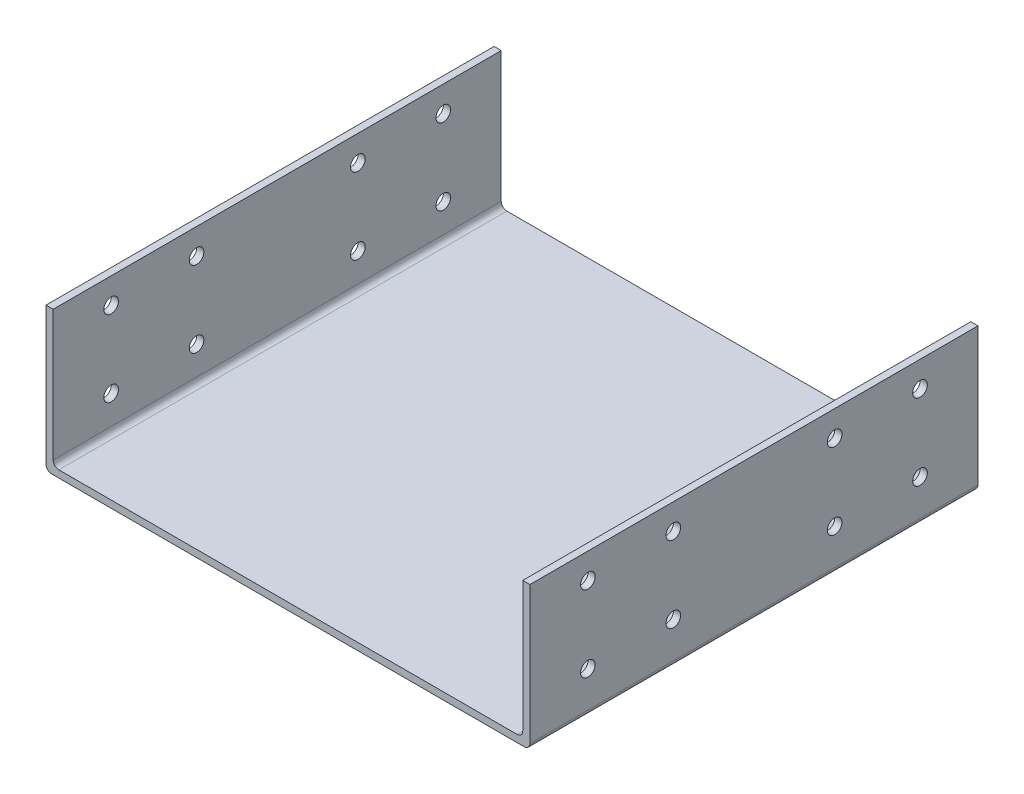
ISO-10303-21;
HEADER;
FILE_DESCRIPTION(('STEP AP214'),'2;1');
FILE_NAME('part.step','',(''),(''),'','','');
FILE_SCHEMA(('AUTOMOTIVE_DESIGN { 1 0 10303 214 1 1 1 1 }'));
ENDSEC;
DATA;
#1=APPLICATION_CONTEXT('core data for automotive mechanical design processes');
#2=APPLICATION_PROTOCOL_DEFINITION('international standard','automotive_design',2000,#1);
#3=PRODUCT_CONTEXT('',#1,'mechanical');
#4=PRODUCT('Part','Part','',(#3));
#5=PRODUCT_RELATED_PRODUCT_CATEGORY('part','',(#4));
#6=PRODUCT_DEFINITION_FORMATION('','',#4);
#7=PRODUCT_DEFINITION_CONTEXT('part definition',#1,'design');
#8=PRODUCT_DEFINITION('design','',#6,#7);
#9=PRODUCT_DEFINITION_SHAPE('','',#8);
#10=(LENGTH_UNIT() NAMED_UNIT(*) SI_UNIT(.MILLI.,.METRE.));
#11=(NAMED_UNIT(*) PLANE_ANGLE_UNIT() SI_UNIT($,.RADIAN.));
#12=(NAMED_UNIT(*) SI_UNIT($,.STERADIAN.) SOLID_ANGLE_UNIT());
#13=UNCERTAINTY_MEASURE_WITH_UNIT(LENGTH_MEASURE(1.E-05),#10,'distance_accuracy_value','');
#14=(GEOMETRIC_REPRESENTATION_CONTEXT(3) GLOBAL_UNCERTAINTY_ASSIGNED_CONTEXT((#13)) GLOBAL_UNIT_ASSIGNED_CONTEXT((#10,
#11,#12)) REPRESENTATION_CONTEXT('',''));
#15=CARTESIAN_POINT('',(0.,0.,0.));
#16=DIRECTION('',(0.,0.,1.));
#17=DIRECTION('',(1.,0.,0.));
#18=AXIS2_PLACEMENT_3D('',#15,#16,#17);
#19=CARTESIAN_POINT('',(0.,50.8,0.));
#20=DIRECTION('',(0.,-1.,0.));
#21=DIRECTION('',(0.,0.,-1.));
#22=AXIS2_PLACEMENT_3D('',#19,#20,#21);
#23=PLANE('',#22);
#24=DIRECTION('',(1.,0.,0.));
#25=VECTOR('',#24,1.);
#26=CARTESIAN_POINT('',(-85.725,50.8,79.375));
#27=LINE('',#26,#25);
#28=CARTESIAN_POINT('',(-85.725,50.8,79.375));
#29=VERTEX_POINT('',#28);
#30=CARTESIAN_POINT('',(-83.185,50.8,79.375));
#31=VERTEX_POINT('',#30);
#32=EDGE_CURVE('E179',#29,#31,#27,.T.);
#33=ORIENTED_EDGE('',*,*,#32,.T.);
#34=DIRECTION('',(0.,0.,1.));
#35=VECTOR('',#34,1.);
#36=CARTESIAN_POINT('',(-83.185,50.8,-79.375));
#37=LINE('',#36,#35);
#38=CARTESIAN_POINT('',(-83.185,50.8,-79.375));
#39=VERTEX_POINT('',#38);
#40=EDGE_CURVE('E159',#39,#31,#37,.T.);
#41=ORIENTED_EDGE('',*,*,#40,.F.);
#42=DIRECTION('',(1.,0.,0.));
#43=VECTOR('',#42,1.);
#44=CARTESIAN_POINT('',(-85.725,50.8,-79.375));
#45=LINE('',#44,#43);
#46=CARTESIAN_POINT('',(-85.725,50.8,-79.375));
#47=VERTEX_POINT('',#46);
#48=EDGE_CURVE('E166',#47,#39,#45,.T.);
#49=ORIENTED_EDGE('',*,*,#48,.F.);
#50=DIRECTION('',(0.,0.,-1.));
#51=VECTOR('',#50,1.);
#52=CARTESIAN_POINT('',(-85.725,50.8,79.375));
#53=LINE('',#52,#51);
#54=EDGE_CURVE('E167',#29,#47,#53,.T.);
#55=ORIENTED_EDGE('',*,*,#54,.F.);
#56=EDGE_LOOP('',(#33,#41,#49,#55));
#57=FACE_BOUND('',#56,.T.);
#58=ADVANCED_FACE('F45',(#57),#23,.F.);
#59=CARTESIAN_POINT('',(-85.725,50.8,79.375));
#60=DIRECTION('',(-1.,0.,0.));
#61=DIRECTION('',(0.,0.,1.));
#62=AXIS2_PLACEMENT_3D('',#59,#60,#61);
#63=PLANE('',#62);
#64=CARTESIAN_POINT('',(-85.725,41.7129,28.58135));
#65=DIRECTION('',(1.,0.,0.));
#66=DIRECTION('',(0.,0.,-1.));
#67=AXIS2_PLACEMENT_3D('',#64,#65,#66);
#68=CIRCLE('',#67,2.5865);
#69=CARTESIAN_POINT('',(-85.725,41.7129,25.99485));
#70=VERTEX_POINT('',#69);
#71=EDGE_CURVE('E613',#70,#70,#68,.T.);
#72=ORIENTED_EDGE('',*,*,#71,.T.);
#73=EDGE_LOOP('',(#72));
#74=FACE_BOUND('',#73,.T.);
#75=CARTESIAN_POINT('',(-85.725,14.7,-58.83275));
#76=DIRECTION('',(1.,0.,0.));
#77=DIRECTION('',(0.,0.,-1.));
#78=AXIS2_PLACEMENT_3D('',#75,#76,#77);
#79=CIRCLE('',#78,2.5908);
#80=CARTESIAN_POINT('',(-85.725,14.7,-61.42355));
#81=VERTEX_POINT('',#80);
#82=EDGE_CURVE('E622',#81,#81,#79,.T.);
#83=ORIENTED_EDGE('',*,*,#82,.T.);
#84=EDGE_LOOP('',(#83));
#85=FACE_BOUND('',#84,.T.);
#86=CARTESIAN_POINT('',(-85.725,41.7129,-58.83275));
#87=DIRECTION('',(1.,0.,0.));
#88=DIRECTION('',(0.,0.,-1.));
#89=AXIS2_PLACEMENT_3D('',#86,#87,#88);
#90=CIRCLE('',#89,2.5908);
#91=CARTESIAN_POINT('',(-85.725,41.7129,-61.42355));
#92=VERTEX_POINT('',#91);
#93=EDGE_CURVE('E597',#92,#92,#90,.T.);
#94=ORIENTED_EDGE('',*,*,#93,.T.);
#95=EDGE_LOOP('',(#94));
#96=FACE_BOUND('',#95,.T.);
#97=CARTESIAN_POINT('',(-85.725,14.7,58.83275));
#98=DIRECTION('',(1.,0.,0.));
#99=DIRECTION('',(0.,0.,-1.));
#100=AXIS2_PLACEMENT_3D('',#97,#98,#99);
#101=CIRCLE('',#100,2.59079999999999);
#102=CARTESIAN_POINT('',(-85.725,14.7,56.24195));
#103=VERTEX_POINT('',#102);
#104=EDGE_CURVE('E606',#103,#103,#101,.T.);
#105=ORIENTED_EDGE('',*,*,#104,.T.);
#106=EDGE_LOOP('',(#105));
#107=FACE_BOUND('',#106,.T.);
#108=CARTESIAN_POINT('',(-85.725,14.7,-28.58135));
#109=DIRECTION('',(1.,0.,0.));
#110=DIRECTION('',(0.,0.,1.));
#111=AXIS2_PLACEMENT_3D('',#108,#109,#110);
#112=CIRCLE('',#111,2.5865);
#113=CARTESIAN_POINT('',(-85.725,14.7,-25.99485));
#114=VERTEX_POINT('',#113);
#115=EDGE_CURVE('E645',#114,#114,#112,.T.);
#116=ORIENTED_EDGE('',*,*,#115,.T.);
#117=EDGE_LOOP('',(#116));
#118=FACE_BOUND('',#117,.T.);
#119=CARTESIAN_POINT('',(-85.725,41.7129,-28.58135));
#120=DIRECTION('',(1.,0.,0.));
#121=DIRECTION('',(0.,0.,-1.));
#122=AXIS2_PLACEMENT_3D('',#119,#120,#121);
#123=CIRCLE('',#122,2.59079999999999);
#124=CARTESIAN_POINT('',(-85.725,41.7129,-31.17215));
#125=VERTEX_POINT('',#124);
#126=EDGE_CURVE('E629',#125,#125,#123,.T.);
#127=ORIENTED_EDGE('',*,*,#126,.T.);
#128=EDGE_LOOP('',(#127));
#129=FACE_BOUND('',#128,.T.);
#130=CARTESIAN_POINT('',(-85.725,14.7,28.58135));
#131=DIRECTION('',(1.,0.,0.));
#132=DIRECTION('',(0.,0.,-1.));
#133=AXIS2_PLACEMENT_3D('',#130,#131,#132);
#134=CIRCLE('',#133,2.5865);
#135=CARTESIAN_POINT('',(-85.725,14.7,25.99485));
#136=VERTEX_POINT('',#135);
#137=EDGE_CURVE('E638',#136,#136,#134,.T.);
#138=ORIENTED_EDGE('',*,*,#137,.T.);
#139=EDGE_LOOP('',(#138));
#140=FACE_BOUND('',#139,.T.);
#141=CARTESIAN_POINT('',(-85.725,41.7129,58.83275));
#142=DIRECTION('',(1.,0.,0.));
#143=DIRECTION('',(0.,0.,-1.));
#144=AXIS2_PLACEMENT_3D('',#141,#142,#143);
#145=CIRCLE('',#144,2.59079999999999);
#146=CARTESIAN_POINT('',(-85.725,41.7129,56.24195));
#147=VERTEX_POINT('',#146);
#148=EDGE_CURVE('E254',#147,#147,#145,.T.);
#149=ORIENTED_EDGE('',*,*,#148,.T.);
#150=EDGE_LOOP('',(#149));
#151=FACE_BOUND('',#150,.T.);
#152=DIRECTION('',(0.,-1.,0.));
#153=VECTOR('',#152,1.);
#154=CARTESIAN_POINT('',(-85.725,50.8,-79.375));
#155=LINE('',#154,#153);
#156=CARTESIAN_POINT('',(-85.725,2.,-79.375));
#157=VERTEX_POINT('',#156);
#158=EDGE_CURVE('E183',#47,#157,#155,.T.);
#159=ORIENTED_EDGE('',*,*,#158,.T.);
#160=DIRECTION('',(0.,0.,-1.));
#161=VECTOR('',#160,1.);
#162=CARTESIAN_POINT('',(-85.725,2.,79.375));
#163=LINE('',#162,#161);
#164=CARTESIAN_POINT('',(-85.725,2.,79.375));
#165=VERTEX_POINT('',#164);
#166=EDGE_CURVE('E216',#157,#165,#163,.F.);
#167=ORIENTED_EDGE('',*,*,#166,.T.);
#168=DIRECTION('',(0.,-1.,0.));
#169=VECTOR('',#168,1.);
#170=CARTESIAN_POINT('',(-85.725,50.8,79.375));
#171=LINE('',#170,#169);
#172=EDGE_CURVE('E190',#29,#165,#171,.T.);
#173=ORIENTED_EDGE('',*,*,#172,.F.);
#174=ORIENTED_EDGE('',*,*,#54,.T.);
#175=EDGE_LOOP('',(#159,#167,#173,#174));
#176=FACE_BOUND('',#175,.T.);
#177=ADVANCED_FACE('F329',(#74,#85,#96,#107,#118,#129,#140,#151,#176),#63,.T.);
#178=CARTESIAN_POINT('',(-85.725,50.8,79.375));
#179=DIRECTION('',(0.,0.,-1.));
#180=DIRECTION('',(-1.,0.,0.));
#181=AXIS2_PLACEMENT_3D('',#178,#179,#180);
#182=PLANE('',#181);
#183=ORIENTED_EDGE('',*,*,#172,.T.);
#184=CARTESIAN_POINT('',(-83.725,2.,79.375));
#185=DIRECTION('',(0.,0.,-1.));
#186=DIRECTION('',(-1.,0.,0.));
#187=AXIS2_PLACEMENT_3D('',#184,#185,#186);
#188=CIRCLE('',#187,2.);
#189=CARTESIAN_POINT('',(-83.725,0.,79.375));
#190=VERTEX_POINT('',#189);
#191=EDGE_CURVE('E221',#165,#190,#188,.F.);
#192=ORIENTED_EDGE('',*,*,#191,.T.);
#193=DIRECTION('',(1.,0.,0.));
#194=VECTOR('',#193,1.);
#195=CARTESIAN_POINT('',(-85.725,0.,79.375));
#196=LINE('',#195,#194);
#197=CARTESIAN_POINT('',(83.725,0.,79.375));
#198=VERTEX_POINT('',#197);
#199=EDGE_CURVE('E173',#190,#198,#196,.T.);
#200=ORIENTED_EDGE('',*,*,#199,.T.);
#201=CARTESIAN_POINT('',(83.725,2.,79.375));
#202=DIRECTION('',(0.,0.,-1.));
#203=DIRECTION('',(-1.,0.,0.));
#204=AXIS2_PLACEMENT_3D('',#201,#202,#203);
#205=CIRCLE('',#204,2.);
#206=CARTESIAN_POINT('',(85.725,2.,79.375));
#207=VERTEX_POINT('',#206);
#208=EDGE_CURVE('E70',#198,#207,#205,.F.);
#209=ORIENTED_EDGE('',*,*,#208,.T.);
#210=DIRECTION('',(0.,-1.,0.));
#211=VECTOR('',#210,1.);
#212=CARTESIAN_POINT('',(85.725,50.8,79.375));
#213=LINE('',#212,#211);
#214=CARTESIAN_POINT('',(85.725,50.8,79.375));
#215=VERTEX_POINT('',#214);
#216=EDGE_CURVE('E195',#215,#207,#213,.T.);
#217=ORIENTED_EDGE('',*,*,#216,.F.);
#218=CARTESIAN_POINT('',(83.185,50.8,79.375));
#219=VERTEX_POINT('',#218);
#220=EDGE_CURVE('E178',#219,#215,#27,.T.);
#221=ORIENTED_EDGE('',*,*,#220,.F.);
#222=DIRECTION('',(0.,1.,0.));
#223=VECTOR('',#222,1.);
#224=CARTESIAN_POINT('',(83.185,50.8,79.375));
#225=LINE('',#224,#223);
#226=CARTESIAN_POINT('',(83.185,4.54000000000002,79.375));
#227=VERTEX_POINT('',#226);
#228=EDGE_CURVE('E155',#227,#219,#225,.T.);
#229=ORIENTED_EDGE('',*,*,#228,.F.);
#230=CARTESIAN_POINT('',(81.185,4.54,79.375));
#231=DIRECTION('',(0.,0.,-1.));
#232=DIRECTION('',(-1.,0.,0.));
#233=AXIS2_PLACEMENT_3D('',#230,#231,#232);
#234=CIRCLE('',#233,2.);
#235=CARTESIAN_POINT('',(81.185,2.54,79.375));
#236=VERTEX_POINT('',#235);
#237=EDGE_CURVE('E55',#227,#236,#234,.T.);
#238=ORIENTED_EDGE('',*,*,#237,.T.);
#239=DIRECTION('',(1.,0.,0.));
#240=VECTOR('',#239,1.);
#241=CARTESIAN_POINT('',(-83.185,2.54,79.375));
#242=LINE('',#241,#240);
#243=CARTESIAN_POINT('',(-81.185,2.54,79.375));
#244=VERTEX_POINT('',#243);
#245=EDGE_CURVE('E310',#244,#236,#242,.T.);
#246=ORIENTED_EDGE('',*,*,#245,.F.);
#247=CARTESIAN_POINT('',(-81.185,4.54,79.375));
#248=DIRECTION('',(0.,0.,-1.));
#249=DIRECTION('',(-1.,0.,0.));
#250=AXIS2_PLACEMENT_3D('',#247,#248,#249);
#251=CIRCLE('',#250,2.);
#252=CARTESIAN_POINT('',(-83.185,4.54000000000002,79.375));
#253=VERTEX_POINT('',#252);
#254=EDGE_CURVE('E241',#244,#253,#251,.T.);
#255=ORIENTED_EDGE('',*,*,#254,.T.);
#256=DIRECTION('',(0.,-1.,0.));
#257=VECTOR('',#256,1.);
#258=CARTESIAN_POINT('',(-83.185,50.8,79.375));
#259=LINE('',#258,#257);
#260=EDGE_CURVE('E300',#31,#253,#259,.T.);
#261=ORIENTED_EDGE('',*,*,#260,.F.);
#262=ORIENTED_EDGE('',*,*,#32,.F.);
#263=EDGE_LOOP('',(#183,#192,#200,#209,#217,#221,#229,#238,#246,#255,#261,#262));
#264=FACE_BOUND('',#263,.T.);
#265=ADVANCED_FACE('F325',(#264),#182,.F.);
#266=CARTESIAN_POINT('',(85.725,50.8,79.375));
#267=DIRECTION('',(-1.,0.,0.));
#268=DIRECTION('',(0.,0.,1.));
#269=AXIS2_PLACEMENT_3D('',#266,#267,#268);
#270=PLANE('',#269);
#271=CARTESIAN_POINT('',(85.725,41.7129,28.58135));
#272=DIRECTION('',(1.,0.,0.));
#273=DIRECTION('',(0.,0.,-1.));
#274=AXIS2_PLACEMENT_3D('',#271,#272,#273);
#275=CIRCLE('',#274,2.5865);
#276=CARTESIAN_POINT('',(85.725,41.7129,25.99485));
#277=VERTEX_POINT('',#276);
#278=EDGE_CURVE('E617',#277,#277,#275,.T.);
#279=ORIENTED_EDGE('',*,*,#278,.F.);
#280=EDGE_LOOP('',(#279));
#281=FACE_BOUND('',#280,.T.);
#282=CARTESIAN_POINT('',(85.725,14.7,-58.83275));
#283=DIRECTION('',(1.,0.,0.));
#284=DIRECTION('',(0.,0.,-1.));
#285=AXIS2_PLACEMENT_3D('',#282,#283,#284);
#286=CIRCLE('',#285,2.5908);
#287=CARTESIAN_POINT('',(85.725,14.7,-61.42355));
#288=VERTEX_POINT('',#287);
#289=EDGE_CURVE('E602',#288,#288,#286,.T.);
#290=ORIENTED_EDGE('',*,*,#289,.F.);
#291=EDGE_LOOP('',(#290));
#292=FACE_BOUND('',#291,.T.);
#293=CARTESIAN_POINT('',(85.725,41.7129,-58.83275));
#294=DIRECTION('',(1.,0.,0.));
#295=DIRECTION('',(0.,0.,-1.));
#296=AXIS2_PLACEMENT_3D('',#293,#294,#295);
#297=CIRCLE('',#296,2.5908);
#298=CARTESIAN_POINT('',(85.725,41.7129,-61.42355));
#299=VERTEX_POINT('',#298);
#300=EDGE_CURVE('E601',#299,#299,#297,.T.);
#301=ORIENTED_EDGE('',*,*,#300,.F.);
#302=EDGE_LOOP('',(#301));
#303=FACE_BOUND('',#302,.T.);
#304=CARTESIAN_POINT('',(85.725,14.7,58.83275));
#305=DIRECTION('',(1.,0.,0.));
#306=DIRECTION('',(0.,0.,-1.));
#307=AXIS2_PLACEMENT_3D('',#304,#305,#306);
#308=CIRCLE('',#307,2.59079999999999);
#309=CARTESIAN_POINT('',(85.725,14.7,56.24195));
#310=VERTEX_POINT('',#309);
#311=EDGE_CURVE('E593',#310,#310,#308,.T.);
#312=ORIENTED_EDGE('',*,*,#311,.F.);
#313=EDGE_LOOP('',(#312));
#314=FACE_BOUND('',#313,.T.);
#315=CARTESIAN_POINT('',(85.725,14.7,-28.58135));
#316=DIRECTION('',(1.,0.,0.));
#317=DIRECTION('',(0.,0.,1.));
#318=AXIS2_PLACEMENT_3D('',#315,#316,#317);
#319=CIRCLE('',#318,2.5865);
#320=CARTESIAN_POINT('',(85.725,14.7,-25.99485));
#321=VERTEX_POINT('',#320);
#322=EDGE_CURVE('E634',#321,#321,#319,.T.);
#323=ORIENTED_EDGE('',*,*,#322,.F.);
#324=EDGE_LOOP('',(#323));
#325=FACE_BOUND('',#324,.T.);
#326=CARTESIAN_POINT('',(85.725,41.7129,-28.58135));
#327=DIRECTION('',(1.,0.,0.));
#328=DIRECTION('',(0.,0.,-1.));
#329=AXIS2_PLACEMENT_3D('',#326,#327,#328);
#330=CIRCLE('',#329,2.59079999999999);
#331=CARTESIAN_POINT('',(85.725,41.7129,-31.17215));
#332=VERTEX_POINT('',#331);
#333=EDGE_CURVE('E633',#332,#332,#330,.T.);
#334=ORIENTED_EDGE('',*,*,#333,.F.);
#335=EDGE_LOOP('',(#334));
#336=FACE_BOUND('',#335,.T.);
#337=CARTESIAN_POINT('',(85.725,14.7,28.58135));
#338=DIRECTION('',(1.,0.,0.));
#339=DIRECTION('',(0.,0.,-1.));
#340=AXIS2_PLACEMENT_3D('',#337,#338,#339);
#341=CIRCLE('',#340,2.5865);
#342=CARTESIAN_POINT('',(85.725,14.7,25.99485));
#343=VERTEX_POINT('',#342);
#344=EDGE_CURVE('E618',#343,#343,#341,.T.);
#345=ORIENTED_EDGE('',*,*,#344,.F.);
#346=EDGE_LOOP('',(#345));
#347=FACE_BOUND('',#346,.T.);
#348=CARTESIAN_POINT('',(85.725,41.7129,58.83275));
#349=DIRECTION('',(1.,0.,0.));
#350=DIRECTION('',(0.,0.,-1.));
#351=AXIS2_PLACEMENT_3D('',#348,#349,#350);
#352=CIRCLE('',#351,2.59079999999999);
#353=CARTESIAN_POINT('',(85.725,41.7129,56.24195));
#354=VERTEX_POINT('',#353);
#355=EDGE_CURVE('E584',#354,#354,#352,.T.);
#356=ORIENTED_EDGE('',*,*,#355,.F.);
#357=EDGE_LOOP('',(#356));
#358=FACE_BOUND('',#357,.T.);
#359=ORIENTED_EDGE('',*,*,#216,.T.);
#360=DIRECTION('',(0.,0.,-1.));
#361=VECTOR('',#360,1.);
#362=CARTESIAN_POINT('',(85.725,2.,-79.375));
#363=LINE('',#362,#361);
#364=CARTESIAN_POINT('',(85.725,2.,-79.375));
#365=VERTEX_POINT('',#364);
#366=EDGE_CURVE('E224',#207,#365,#363,.T.);
#367=ORIENTED_EDGE('',*,*,#366,.T.);
#368=DIRECTION('',(0.,-1.,0.));
#369=VECTOR('',#368,1.);
#370=CARTESIAN_POINT('',(85.725,50.8,-79.375));
#371=LINE('',#370,#369);
#372=CARTESIAN_POINT('',(85.725,50.8,-79.375));
#373=VERTEX_POINT('',#372);
#374=EDGE_CURVE('E198',#373,#365,#371,.T.);
#375=ORIENTED_EDGE('',*,*,#374,.F.);
#376=DIRECTION('',(0.,0.,-1.));
#377=VECTOR('',#376,1.);
#378=CARTESIAN_POINT('',(85.725,50.8,79.375));
#379=LINE('',#378,#377);
#380=EDGE_CURVE('E163',#215,#373,#379,.T.);
#381=ORIENTED_EDGE('',*,*,#380,.F.);
#382=EDGE_LOOP('',(#359,#367,#375,#381));
#383=FACE_BOUND('',#382,.T.);
#384=ADVANCED_FACE('F343',(#281,#292,#303,#314,#325,#336,#347,#358,#383),#270,.F.);
#385=CARTESIAN_POINT('',(-85.725,50.8,-79.375));
#386=DIRECTION('',(0.,0.,-1.));
#387=DIRECTION('',(-1.,0.,0.));
#388=AXIS2_PLACEMENT_3D('',#385,#386,#387);
#389=PLANE('',#388);
#390=DIRECTION('',(1.,0.,0.));
#391=VECTOR('',#390,1.);
#392=CARTESIAN_POINT('',(-85.725,0.,-79.375));
#393=LINE('',#392,#391);
#394=CARTESIAN_POINT('',(-83.725,0.,-79.375));
#395=VERTEX_POINT('',#394);
#396=CARTESIAN_POINT('',(83.725,0.,-79.375));
#397=VERTEX_POINT('',#396);
#398=EDGE_CURVE('E184',#395,#397,#393,.T.);
#399=ORIENTED_EDGE('',*,*,#398,.F.);
#400=CARTESIAN_POINT('',(-83.725,2.,-79.375));
#401=DIRECTION('',(0.,0.,-1.));
#402=DIRECTION('',(-1.,0.,0.));
#403=AXIS2_PLACEMENT_3D('',#400,#401,#402);
#404=CIRCLE('',#403,2.);
#405=EDGE_CURVE('E213',#395,#157,#404,.T.);
#406=ORIENTED_EDGE('',*,*,#405,.T.);
#407=ORIENTED_EDGE('',*,*,#158,.F.);
#408=ORIENTED_EDGE('',*,*,#48,.T.);
#409=DIRECTION('',(0.,-1.,0.));
#410=VECTOR('',#409,1.);
#411=CARTESIAN_POINT('',(-83.185,50.8,-79.375));
#412=LINE('',#411,#410);
#413=CARTESIAN_POINT('',(-83.185,4.54000000000002,-79.375));
#414=VERTEX_POINT('',#413);
#415=EDGE_CURVE('E301',#39,#414,#412,.T.);
#416=ORIENTED_EDGE('',*,*,#415,.T.);
#417=CARTESIAN_POINT('',(-81.185,4.54,-79.375));
#418=DIRECTION('',(0.,0.,-1.));
#419=DIRECTION('',(-1.,0.,0.));
#420=AXIS2_PLACEMENT_3D('',#417,#418,#419);
#421=CIRCLE('',#420,2.);
#422=CARTESIAN_POINT('',(-81.185,2.54,-79.375));
#423=VERTEX_POINT('',#422);
#424=EDGE_CURVE('E244',#414,#423,#421,.F.);
#425=ORIENTED_EDGE('',*,*,#424,.T.);
#426=DIRECTION('',(1.,0.,0.));
#427=VECTOR('',#426,1.);
#428=CARTESIAN_POINT('',(-83.185,2.54,-79.375));
#429=LINE('',#428,#427);
#430=CARTESIAN_POINT('',(81.185,2.54,-79.375));
#431=VERTEX_POINT('',#430);
#432=EDGE_CURVE('E150',#423,#431,#429,.T.);
#433=ORIENTED_EDGE('',*,*,#432,.T.);
#434=CARTESIAN_POINT('',(81.185,4.54,-79.375));
#435=DIRECTION('',(0.,0.,-1.));
#436=DIRECTION('',(-1.,0.,0.));
#437=AXIS2_PLACEMENT_3D('',#434,#435,#436);
#438=CIRCLE('',#437,2.);
#439=CARTESIAN_POINT('',(83.185,4.54000000000002,-79.375));
#440=VERTEX_POINT('',#439);
#441=EDGE_CURVE('E11',#431,#440,#438,.F.);
#442=ORIENTED_EDGE('',*,*,#441,.T.);
#443=DIRECTION('',(0.,1.,0.));
#444=VECTOR('',#443,1.);
#445=CARTESIAN_POINT('',(83.185,50.8,-79.375));
#446=LINE('',#445,#444);
#447=CARTESIAN_POINT('',(83.185,50.8,-79.375));
#448=VERTEX_POINT('',#447);
#449=EDGE_CURVE('E137',#440,#448,#446,.T.);
#450=ORIENTED_EDGE('',*,*,#449,.T.);
#451=EDGE_CURVE('E143',#448,#373,#45,.T.);
#452=ORIENTED_EDGE('',*,*,#451,.T.);
#453=ORIENTED_EDGE('',*,*,#374,.T.);
#454=CARTESIAN_POINT('',(83.725,2.,-79.375));
#455=DIRECTION('',(0.,0.,-1.));
#456=DIRECTION('',(-1.,0.,0.));
#457=AXIS2_PLACEMENT_3D('',#454,#455,#456);
#458=CIRCLE('',#457,2.);
#459=EDGE_CURVE('E210',#365,#397,#458,.T.);
#460=ORIENTED_EDGE('',*,*,#459,.T.);
#461=EDGE_LOOP('',(#399,#406,#407,#408,#416,#425,#433,#442,#450,#452,#453,#460));
#462=FACE_BOUND('',#461,.T.);
#463=ADVANCED_FACE('F140',(#462),#389,.T.);
#464=ORIENTED_EDGE('',*,*,#451,.F.);
#465=DIRECTION('',(0.,0.,1.));
#466=VECTOR('',#465,1.);
#467=CARTESIAN_POINT('',(83.185,50.8,-79.375));
#468=LINE('',#467,#466);
#469=EDGE_CURVE('E149',#448,#219,#468,.T.);
#470=ORIENTED_EDGE('',*,*,#469,.T.);
#471=ORIENTED_EDGE('',*,*,#220,.T.);
#472=ORIENTED_EDGE('',*,*,#380,.T.);
#473=EDGE_LOOP('',(#464,#470,#471,#472));
#474=FACE_BOUND('',#473,.T.);
#475=ADVANCED_FACE('F161',(#474),#23,.F.);
#476=CARTESIAN_POINT('',(0.,0.,0.));
#477=DIRECTION('',(0.,-1.,0.));
#478=DIRECTION('',(0.,0.,-1.));
#479=AXIS2_PLACEMENT_3D('',#476,#477,#478);
#480=PLANE('',#479);
#481=ORIENTED_EDGE('',*,*,#199,.F.);
#482=DIRECTION('',(0.,0.,-1.));
#483=VECTOR('',#482,1.);
#484=CARTESIAN_POINT('',(-83.725,0.,0.));
#485=LINE('',#484,#483);
#486=EDGE_CURVE('E206',#190,#395,#485,.T.);
#487=ORIENTED_EDGE('',*,*,#486,.T.);
#488=ORIENTED_EDGE('',*,*,#398,.T.);
#489=DIRECTION('',(0.,0.,-1.));
#490=VECTOR('',#489,1.);
#491=CARTESIAN_POINT('',(83.725,0.,79.375));
#492=LINE('',#491,#490);
#493=EDGE_CURVE('E194',#397,#198,#492,.F.);
#494=ORIENTED_EDGE('',*,*,#493,.T.);
#495=EDGE_LOOP('',(#481,#487,#488,#494));
#496=FACE_BOUND('',#495,.T.);
#497=ADVANCED_FACE('F337',(#496),#480,.T.);
#498=CARTESIAN_POINT('',(-83.185,50.8,-79.375));
#499=DIRECTION('',(-1.,0.,0.));
#500=DIRECTION('',(0.,0.,1.));
#501=AXIS2_PLACEMENT_3D('',#498,#499,#500);
#502=PLANE('',#501);
#503=CARTESIAN_POINT('',(-83.185,41.7129,28.58135));
#504=DIRECTION('',(-1.,0.,0.));
#505=DIRECTION('',(0.,0.,1.));
#506=AXIS2_PLACEMENT_3D('',#503,#504,#505);
#507=CIRCLE('',#506,2.5865);
#508=CARTESIAN_POINT('',(-83.185,41.7129,31.16785));
#509=VERTEX_POINT('',#508);
#510=EDGE_CURVE('E296',#509,#509,#507,.T.);
#511=ORIENTED_EDGE('',*,*,#510,.T.);
#512=EDGE_LOOP('',(#511));
#513=FACE_BOUND('',#512,.T.);
#514=CARTESIAN_POINT('',(-83.185,14.7,-58.83275));
#515=DIRECTION('',(-1.,0.,0.));
#516=DIRECTION('',(0.,0.,1.));
#517=AXIS2_PLACEMENT_3D('',#514,#515,#516);
#518=CIRCLE('',#517,2.5908);
#519=CARTESIAN_POINT('',(-83.185,14.7,-56.24195));
#520=VERTEX_POINT('',#519);
#521=EDGE_CURVE('E282',#520,#520,#518,.T.);
#522=ORIENTED_EDGE('',*,*,#521,.T.);
#523=EDGE_LOOP('',(#522));
#524=FACE_BOUND('',#523,.T.);
#525=CARTESIAN_POINT('',(-83.185,41.7129,-58.83275));
#526=DIRECTION('',(-1.,0.,0.));
#527=DIRECTION('',(0.,0.,1.));
#528=AXIS2_PLACEMENT_3D('',#525,#526,#527);
#529=CIRCLE('',#528,2.5908);
#530=CARTESIAN_POINT('',(-83.185,41.7129,-56.24195));
#531=VERTEX_POINT('',#530);
#532=EDGE_CURVE('E278',#531,#531,#529,.T.);
#533=ORIENTED_EDGE('',*,*,#532,.T.);
#534=EDGE_LOOP('',(#533));
#535=FACE_BOUND('',#534,.T.);
#536=CARTESIAN_POINT('',(-83.185,14.7,58.83275));
#537=DIRECTION('',(-1.,0.,0.));
#538=DIRECTION('',(0.,0.,1.));
#539=AXIS2_PLACEMENT_3D('',#536,#537,#538);
#540=CIRCLE('',#539,2.59079999999999);
#541=CARTESIAN_POINT('',(-83.185,14.7,61.42355));
#542=VERTEX_POINT('',#541);
#543=EDGE_CURVE('E274',#542,#542,#540,.T.);
#544=ORIENTED_EDGE('',*,*,#543,.T.);
#545=EDGE_LOOP('',(#544));
#546=FACE_BOUND('',#545,.T.);
#547=CARTESIAN_POINT('',(-83.185,14.7,-28.58135));
#548=DIRECTION('',(-1.,0.,0.));
#549=DIRECTION('',(0.,0.,1.));
#550=AXIS2_PLACEMENT_3D('',#547,#548,#549);
#551=CIRCLE('',#550,2.5865);
#552=CARTESIAN_POINT('',(-83.185,14.7,-25.99485));
#553=VERTEX_POINT('',#552);
#554=EDGE_CURVE('E269',#553,#553,#551,.T.);
#555=ORIENTED_EDGE('',*,*,#554,.T.);
#556=EDGE_LOOP('',(#555));
#557=FACE_BOUND('',#556,.T.);
#558=CARTESIAN_POINT('',(-83.185,41.7129,-28.58135));
#559=DIRECTION('',(-1.,0.,0.));
#560=DIRECTION('',(0.,0.,1.));
#561=AXIS2_PLACEMENT_3D('',#558,#559,#560);
#562=CIRCLE('',#561,2.59079999999999);
#563=CARTESIAN_POINT('',(-83.185,41.7129,-25.99055));
#564=VERTEX_POINT('',#563);
#565=EDGE_CURVE('E264',#564,#564,#562,.T.);
#566=ORIENTED_EDGE('',*,*,#565,.T.);
#567=EDGE_LOOP('',(#566));
#568=FACE_BOUND('',#567,.T.);
#569=CARTESIAN_POINT('',(-83.185,14.7,28.58135));
#570=DIRECTION('',(-1.,0.,0.));
#571=DIRECTION('',(0.,0.,1.));
#572=AXIS2_PLACEMENT_3D('',#569,#570,#571);
#573=CIRCLE('',#572,2.5865);
#574=CARTESIAN_POINT('',(-83.185,14.7,31.16785));
#575=VERTEX_POINT('',#574);
#576=EDGE_CURVE('E259',#575,#575,#573,.T.);
#577=ORIENTED_EDGE('',*,*,#576,.T.);
#578=EDGE_LOOP('',(#577));
#579=FACE_BOUND('',#578,.T.);
#580=CARTESIAN_POINT('',(-83.185,41.7129,58.83275));
#581=DIRECTION('',(-1.,0.,0.));
#582=DIRECTION('',(0.,0.,1.));
#583=AXIS2_PLACEMENT_3D('',#580,#581,#582);
#584=CIRCLE('',#583,2.59079999999999);
#585=CARTESIAN_POINT('',(-83.185,41.7129,61.42355));
#586=VERTEX_POINT('',#585);
#587=EDGE_CURVE('E253',#586,#586,#584,.T.);
#588=ORIENTED_EDGE('',*,*,#587,.T.);
#589=EDGE_LOOP('',(#588));
#590=FACE_BOUND('',#589,.T.);
#591=ORIENTED_EDGE('',*,*,#260,.T.);
#592=DIRECTION('',(0.,0.,1.));
#593=VECTOR('',#592,1.);
#594=CARTESIAN_POINT('',(-83.185,4.54,-79.375));
#595=LINE('',#594,#593);
#596=EDGE_CURVE('E235',#253,#414,#595,.F.);
#597=ORIENTED_EDGE('',*,*,#596,.T.);
#598=ORIENTED_EDGE('',*,*,#415,.F.);
#599=ORIENTED_EDGE('',*,*,#40,.T.);
#600=EDGE_LOOP('',(#591,#597,#598,#599));
#601=FACE_BOUND('',#600,.T.);
#602=ADVANCED_FACE('F320',(#513,#524,#535,#546,#557,#568,#579,#590,#601),#502,.F.);
#603=CARTESIAN_POINT('',(83.185,50.8,-79.375));
#604=DIRECTION('',(1.,0.,0.));
#605=DIRECTION('',(0.,0.,-1.));
#606=AXIS2_PLACEMENT_3D('',#603,#604,#605);
#607=PLANE('',#606);
#608=CARTESIAN_POINT('',(83.185,41.7129,28.58135));
#609=DIRECTION('',(1.,0.,0.));
#610=DIRECTION('',(0.,0.,-1.));
#611=AXIS2_PLACEMENT_3D('',#608,#609,#610);
#612=CIRCLE('',#611,2.5865);
#613=CARTESIAN_POINT('',(83.185,41.7129,25.99485));
#614=VERTEX_POINT('',#613);
#615=EDGE_CURVE('E49',#614,#614,#612,.T.);
#616=ORIENTED_EDGE('',*,*,#615,.T.);
#617=EDGE_LOOP('',(#616));
#618=FACE_BOUND('',#617,.T.);
#619=CARTESIAN_POINT('',(83.185,14.7,-58.83275));
#620=DIRECTION('',(1.,0.,0.));
#621=DIRECTION('',(0.,0.,-1.));
#622=AXIS2_PLACEMENT_3D('',#619,#620,#621);
#623=CIRCLE('',#622,2.5908);
#624=CARTESIAN_POINT('',(83.185,14.7,-61.42355));
#625=VERTEX_POINT('',#624);
#626=EDGE_CURVE('E279',#625,#625,#623,.T.);
#627=ORIENTED_EDGE('',*,*,#626,.T.);
#628=EDGE_LOOP('',(#627));
#629=FACE_BOUND('',#628,.T.);
#630=CARTESIAN_POINT('',(83.185,41.7129,-58.83275));
#631=DIRECTION('',(1.,0.,0.));
#632=DIRECTION('',(0.,0.,-1.));
#633=AXIS2_PLACEMENT_3D('',#630,#631,#632);
#634=CIRCLE('',#633,2.5908);
#635=CARTESIAN_POINT('',(83.185,41.7129,-61.42355));
#636=VERTEX_POINT('',#635);
#637=EDGE_CURVE('E275',#636,#636,#634,.T.);
#638=ORIENTED_EDGE('',*,*,#637,.T.);
#639=EDGE_LOOP('',(#638));
#640=FACE_BOUND('',#639,.T.);
#641=CARTESIAN_POINT('',(83.185,14.7,58.83275));
#642=DIRECTION('',(1.,0.,0.));
#643=DIRECTION('',(0.,0.,-1.));
#644=AXIS2_PLACEMENT_3D('',#641,#642,#643);
#645=CIRCLE('',#644,2.59079999999999);
#646=CARTESIAN_POINT('',(83.185,14.7,56.24195));
#647=VERTEX_POINT('',#646);
#648=EDGE_CURVE('E270',#647,#647,#645,.T.);
#649=ORIENTED_EDGE('',*,*,#648,.T.);
#650=EDGE_LOOP('',(#649));
#651=FACE_BOUND('',#650,.T.);
#652=CARTESIAN_POINT('',(83.185,14.7,-28.58135));
#653=DIRECTION('',(1.,0.,0.));
#654=DIRECTION('',(0.,0.,-1.));
#655=AXIS2_PLACEMENT_3D('',#652,#653,#654);
#656=CIRCLE('',#655,2.5865);
#657=CARTESIAN_POINT('',(83.185,14.7,-31.16785));
#658=VERTEX_POINT('',#657);
#659=EDGE_CURVE('E265',#658,#658,#656,.T.);
#660=ORIENTED_EDGE('',*,*,#659,.T.);
#661=EDGE_LOOP('',(#660));
#662=FACE_BOUND('',#661,.T.);
#663=CARTESIAN_POINT('',(83.185,41.7129,-28.58135));
#664=DIRECTION('',(1.,0.,0.));
#665=DIRECTION('',(0.,0.,-1.));
#666=AXIS2_PLACEMENT_3D('',#663,#664,#665);
#667=CIRCLE('',#666,2.59079999999999);
#668=CARTESIAN_POINT('',(83.185,41.7129,-31.17215));
#669=VERTEX_POINT('',#668);
#670=EDGE_CURVE('E260',#669,#669,#667,.T.);
#671=ORIENTED_EDGE('',*,*,#670,.T.);
#672=EDGE_LOOP('',(#671));
#673=FACE_BOUND('',#672,.T.);
#674=CARTESIAN_POINT('',(83.185,14.7,28.58135));
#675=DIRECTION('',(1.,0.,0.));
#676=DIRECTION('',(0.,0.,-1.));
#677=AXIS2_PLACEMENT_3D('',#674,#675,#676);
#678=CIRCLE('',#677,2.5865);
#679=CARTESIAN_POINT('',(83.185,14.7,25.99485));
#680=VERTEX_POINT('',#679);
#681=EDGE_CURVE('E255',#680,#680,#678,.T.);
#682=ORIENTED_EDGE('',*,*,#681,.T.);
#683=EDGE_LOOP('',(#682));
#684=FACE_BOUND('',#683,.T.);
#685=CARTESIAN_POINT('',(83.185,41.7129,58.83275));
#686=DIRECTION('',(1.,0.,0.));
#687=DIRECTION('',(0.,0.,-1.));
#688=AXIS2_PLACEMENT_3D('',#685,#686,#687);
#689=CIRCLE('',#688,2.59079999999999);
#690=CARTESIAN_POINT('',(83.185,41.7129,56.24195));
#691=VERTEX_POINT('',#690);
#692=EDGE_CURVE('E249',#691,#691,#689,.T.);
#693=ORIENTED_EDGE('',*,*,#692,.T.);
#694=EDGE_LOOP('',(#693));
#695=FACE_BOUND('',#694,.T.);
#696=ORIENTED_EDGE('',*,*,#449,.F.);
#697=DIRECTION('',(0.,0.,1.));
#698=VECTOR('',#697,1.);
#699=CARTESIAN_POINT('',(83.185,4.54,79.375));
#700=LINE('',#699,#698);
#701=EDGE_CURVE('E238',#440,#227,#700,.T.);
#702=ORIENTED_EDGE('',*,*,#701,.T.);
#703=ORIENTED_EDGE('',*,*,#228,.T.);
#704=ORIENTED_EDGE('',*,*,#469,.F.);
#705=EDGE_LOOP('',(#696,#702,#703,#704));
#706=FACE_BOUND('',#705,.T.);
#707=ADVANCED_FACE('F153',(#618,#629,#640,#651,#662,#673,#684,#695,#706),#607,.F.);
#708=CARTESIAN_POINT('',(-83.185,2.54,-79.375));
#709=DIRECTION('',(0.,-1.,0.));
#710=DIRECTION('',(0.,0.,-1.));
#711=AXIS2_PLACEMENT_3D('',#708,#709,#710);
#712=PLANE('',#711);
#713=ORIENTED_EDGE('',*,*,#432,.F.);
#714=DIRECTION('',(0.,0.,1.));
#715=VECTOR('',#714,1.);
#716=CARTESIAN_POINT('',(-81.185,2.54,79.375));
#717=LINE('',#716,#715);
#718=EDGE_CURVE('E231',#423,#244,#717,.T.);
#719=ORIENTED_EDGE('',*,*,#718,.T.);
#720=ORIENTED_EDGE('',*,*,#245,.T.);
#721=DIRECTION('',(0.,0.,1.));
#722=VECTOR('',#721,1.);
#723=CARTESIAN_POINT('',(81.185,2.54,-79.375));
#724=LINE('',#723,#722);
#725=EDGE_CURVE('E228',#236,#431,#724,.F.);
#726=ORIENTED_EDGE('',*,*,#725,.T.);
#727=EDGE_LOOP('',(#713,#719,#720,#726));
#728=FACE_BOUND('',#727,.T.);
#729=ADVANCED_FACE('F347',(#728),#712,.F.);
#730=CARTESIAN_POINT('',(-83.725,2.,0.));
#731=DIRECTION('',(0.,0.,-1.));
#732=DIRECTION('',(-1.,0.,0.));
#733=AXIS2_PLACEMENT_3D('',#730,#731,#732);
#734=CYLINDRICAL_SURFACE('',#733,2.);
#735=ORIENTED_EDGE('',*,*,#191,.F.);
#736=ORIENTED_EDGE('',*,*,#166,.F.);
#737=ORIENTED_EDGE('',*,*,#405,.F.);
#738=ORIENTED_EDGE('',*,*,#486,.F.);
#739=EDGE_LOOP('',(#735,#736,#737,#738));
#740=FACE_BOUND('',#739,.T.);
#741=ADVANCED_FACE('F335',(#740),#734,.T.);
#742=CARTESIAN_POINT('',(83.725,2.,79.375));
#743=DIRECTION('',(0.,0.,1.));
#744=DIRECTION('',(1.,0.,0.));
#745=AXIS2_PLACEMENT_3D('',#742,#743,#744);
#746=CYLINDRICAL_SURFACE('',#745,2.);
#747=ORIENTED_EDGE('',*,*,#208,.F.);
#748=ORIENTED_EDGE('',*,*,#493,.F.);
#749=ORIENTED_EDGE('',*,*,#459,.F.);
#750=ORIENTED_EDGE('',*,*,#366,.F.);
#751=EDGE_LOOP('',(#747,#748,#749,#750));
#752=FACE_BOUND('',#751,.T.);
#753=ADVANCED_FACE('F341',(#752),#746,.T.);
#754=CARTESIAN_POINT('',(-81.185,4.54,-79.375));
#755=DIRECTION('',(0.,0.,-1.));
#756=DIRECTION('',(-1.,0.,0.));
#757=AXIS2_PLACEMENT_3D('',#754,#755,#756);
#758=CYLINDRICAL_SURFACE('',#757,2.);
#759=ORIENTED_EDGE('',*,*,#424,.F.);
#760=ORIENTED_EDGE('',*,*,#596,.F.);
#761=ORIENTED_EDGE('',*,*,#254,.F.);
#762=ORIENTED_EDGE('',*,*,#718,.F.);
#763=EDGE_LOOP('',(#759,#760,#761,#762));
#764=FACE_BOUND('',#763,.T.);
#765=ADVANCED_FACE('F351',(#764),#758,.F.);
#766=CARTESIAN_POINT('',(81.185,4.54,-79.375));
#767=DIRECTION('',(0.,0.,-1.));
#768=DIRECTION('',(-1.,0.,0.));
#769=AXIS2_PLACEMENT_3D('',#766,#767,#768);
#770=CYLINDRICAL_SURFACE('',#769,2.);
#771=ORIENTED_EDGE('',*,*,#441,.F.);
#772=ORIENTED_EDGE('',*,*,#725,.F.);
#773=ORIENTED_EDGE('',*,*,#237,.F.);
#774=ORIENTED_EDGE('',*,*,#701,.F.);
#775=EDGE_LOOP('',(#771,#772,#773,#774));
#776=FACE_BOUND('',#775,.T.);
#777=ADVANCED_FACE('F47',(#776),#770,.F.);
#778=CARTESIAN_POINT('',(-85.725,41.7129,58.83275));
#779=DIRECTION('',(1.,0.,0.));
#780=DIRECTION('',(0.,0.,-1.));
#781=AXIS2_PLACEMENT_3D('',#778,#779,#780);
#782=CYLINDRICAL_SURFACE('',#781,2.59079999999999);
#783=ORIENTED_EDGE('',*,*,#355,.T.);
#784=EDGE_LOOP('',(#783));
#785=FACE_BOUND('',#784,.T.);
#786=ORIENTED_EDGE('',*,*,#692,.F.);
#787=EDGE_LOOP('',(#786));
#788=FACE_BOUND('',#787,.T.);
#789=ADVANCED_FACE('F350',(#785,#788),#782,.F.);
#790=CARTESIAN_POINT('',(-85.725,14.7,28.58135));
#791=DIRECTION('',(1.,0.,0.));
#792=DIRECTION('',(0.,0.,-1.));
#793=AXIS2_PLACEMENT_3D('',#790,#791,#792);
#794=CYLINDRICAL_SURFACE('',#793,2.5865);
#795=ORIENTED_EDGE('',*,*,#344,.T.);
#796=EDGE_LOOP('',(#795));
#797=FACE_BOUND('',#796,.T.);
#798=ORIENTED_EDGE('',*,*,#681,.F.);
#799=EDGE_LOOP('',(#798));
#800=FACE_BOUND('',#799,.T.);
#801=ADVANCED_FACE('F357',(#797,#800),#794,.F.);
#802=CARTESIAN_POINT('',(-85.725,41.7129,-28.58135));
#803=DIRECTION('',(1.,0.,0.));
#804=DIRECTION('',(0.,0.,-1.));
#805=AXIS2_PLACEMENT_3D('',#802,#803,#804);
#806=CYLINDRICAL_SURFACE('',#805,2.59079999999999);
#807=ORIENTED_EDGE('',*,*,#333,.T.);
#808=EDGE_LOOP('',(#807));
#809=FACE_BOUND('',#808,.T.);
#810=ORIENTED_EDGE('',*,*,#670,.F.);
#811=EDGE_LOOP('',(#810));
#812=FACE_BOUND('',#811,.T.);
#813=ADVANCED_FACE('F418',(#809,#812),#806,.F.);
#814=CARTESIAN_POINT('',(-85.725,14.7,-28.58135));
#815=DIRECTION('',(1.,0.,0.));
#816=DIRECTION('',(0.,0.,-1.));
#817=AXIS2_PLACEMENT_3D('',#814,#815,#816);
#818=CYLINDRICAL_SURFACE('',#817,2.5865);
#819=ORIENTED_EDGE('',*,*,#322,.T.);
#820=EDGE_LOOP('',(#819));
#821=FACE_BOUND('',#820,.T.);
#822=ORIENTED_EDGE('',*,*,#659,.F.);
#823=EDGE_LOOP('',(#822));
#824=FACE_BOUND('',#823,.T.);
#825=ADVANCED_FACE('F429',(#821,#824),#818,.F.);
#826=CARTESIAN_POINT('',(-85.725,14.7,58.83275));
#827=DIRECTION('',(1.,0.,0.));
#828=DIRECTION('',(0.,0.,-1.));
#829=AXIS2_PLACEMENT_3D('',#826,#827,#828);
#830=CYLINDRICAL_SURFACE('',#829,2.59079999999999);
#831=ORIENTED_EDGE('',*,*,#311,.T.);
#832=EDGE_LOOP('',(#831));
#833=FACE_BOUND('',#832,.T.);
#834=ORIENTED_EDGE('',*,*,#648,.F.);
#835=EDGE_LOOP('',(#834));
#836=FACE_BOUND('',#835,.T.);
#837=ADVANCED_FACE('F440',(#833,#836),#830,.F.);
#838=CARTESIAN_POINT('',(-85.725,41.7129,-58.83275));
#839=DIRECTION('',(1.,0.,0.));
#840=DIRECTION('',(0.,0.,-1.));
#841=AXIS2_PLACEMENT_3D('',#838,#839,#840);
#842=CYLINDRICAL_SURFACE('',#841,2.5908);
#843=ORIENTED_EDGE('',*,*,#300,.T.);
#844=EDGE_LOOP('',(#843));
#845=FACE_BOUND('',#844,.T.);
#846=ORIENTED_EDGE('',*,*,#637,.F.);
#847=EDGE_LOOP('',(#846));
#848=FACE_BOUND('',#847,.T.);
#849=ADVANCED_FACE('F451',(#845,#848),#842,.F.);
#850=CARTESIAN_POINT('',(-85.725,14.7,-58.83275));
#851=DIRECTION('',(1.,0.,0.));
#852=DIRECTION('',(0.,0.,-1.));
#853=AXIS2_PLACEMENT_3D('',#850,#851,#852);
#854=CYLINDRICAL_SURFACE('',#853,2.5908);
#855=ORIENTED_EDGE('',*,*,#289,.T.);
#856=EDGE_LOOP('',(#855));
#857=FACE_BOUND('',#856,.T.);
#858=ORIENTED_EDGE('',*,*,#626,.F.);
#859=EDGE_LOOP('',(#858));
#860=FACE_BOUND('',#859,.T.);
#861=ADVANCED_FACE('F462',(#857,#860),#854,.F.);
#862=CARTESIAN_POINT('',(-85.725,41.7129,28.58135));
#863=DIRECTION('',(1.,0.,0.));
#864=DIRECTION('',(0.,0.,-1.));
#865=AXIS2_PLACEMENT_3D('',#862,#863,#864);
#866=CYLINDRICAL_SURFACE('',#865,2.5865);
#867=ORIENTED_EDGE('',*,*,#278,.T.);
#868=EDGE_LOOP('',(#867));
#869=FACE_BOUND('',#868,.T.);
#870=ORIENTED_EDGE('',*,*,#615,.F.);
#871=EDGE_LOOP('',(#870));
#872=FACE_BOUND('',#871,.T.);
#873=ADVANCED_FACE('F473',(#869,#872),#866,.F.);
#874=ORIENTED_EDGE('',*,*,#148,.F.);
#875=EDGE_LOOP('',(#874));
#876=FACE_BOUND('',#875,.T.);
#877=ORIENTED_EDGE('',*,*,#587,.F.);
#878=EDGE_LOOP('',(#877));
#879=FACE_BOUND('',#878,.T.);
#880=ADVANCED_FACE('F360',(#876,#879),#782,.F.);
#881=ORIENTED_EDGE('',*,*,#137,.F.);
#882=EDGE_LOOP('',(#881));
#883=FACE_BOUND('',#882,.T.);
#884=ORIENTED_EDGE('',*,*,#576,.F.);
#885=EDGE_LOOP('',(#884));
#886=FACE_BOUND('',#885,.T.);
#887=ADVANCED_FACE('F421',(#883,#886),#794,.F.);
#888=ORIENTED_EDGE('',*,*,#126,.F.);
#889=EDGE_LOOP('',(#888));
#890=FACE_BOUND('',#889,.T.);
#891=ORIENTED_EDGE('',*,*,#565,.F.);
#892=EDGE_LOOP('',(#891));
#893=FACE_BOUND('',#892,.T.);
#894=ADVANCED_FACE('F432',(#890,#893),#806,.F.);
#895=ORIENTED_EDGE('',*,*,#115,.F.);
#896=EDGE_LOOP('',(#895));
#897=FACE_BOUND('',#896,.T.);
#898=ORIENTED_EDGE('',*,*,#554,.F.);
#899=EDGE_LOOP('',(#898));
#900=FACE_BOUND('',#899,.T.);
#901=ADVANCED_FACE('F443',(#897,#900),#818,.F.);
#902=ORIENTED_EDGE('',*,*,#104,.F.);
#903=EDGE_LOOP('',(#902));
#904=FACE_BOUND('',#903,.T.);
#905=ORIENTED_EDGE('',*,*,#543,.F.);
#906=EDGE_LOOP('',(#905));
#907=FACE_BOUND('',#906,.T.);
#908=ADVANCED_FACE('F454',(#904,#907),#830,.F.);
#909=ORIENTED_EDGE('',*,*,#93,.F.);
#910=EDGE_LOOP('',(#909));
#911=FACE_BOUND('',#910,.T.);
#912=ORIENTED_EDGE('',*,*,#532,.F.);
#913=EDGE_LOOP('',(#912));
#914=FACE_BOUND('',#913,.T.);
#915=ADVANCED_FACE('F465',(#911,#914),#842,.F.);
#916=ORIENTED_EDGE('',*,*,#82,.F.);
#917=EDGE_LOOP('',(#916));
#918=FACE_BOUND('',#917,.T.);
#919=ORIENTED_EDGE('',*,*,#521,.F.);
#920=EDGE_LOOP('',(#919));
#921=FACE_BOUND('',#920,.T.);
#922=ADVANCED_FACE('F476',(#918,#921),#854,.F.);
#923=ORIENTED_EDGE('',*,*,#71,.F.);
#924=EDGE_LOOP('',(#923));
#925=FACE_BOUND('',#924,.T.);
#926=ORIENTED_EDGE('',*,*,#510,.F.);
#927=EDGE_LOOP('',(#926));
#928=FACE_BOUND('',#927,.T.);
#929=ADVANCED_FACE('F486',(#925,#928),#866,.F.);
#930=CLOSED_SHELL('',(#58,#177,#265,#384,#463,#475,#497,#602,#707,#729,#741,#753,#765,#777,#789,
#801,#813,#825,#837,#849,#861,#873,#880,#887,#894,#901,#908,#915,#922,#929));
#931=MANIFOLD_SOLID_BREP('B2',#930);
#932=ADVANCED_BREP_SHAPE_REPRESENTATION('',(#18,#931),#14);
#933=SHAPE_DEFINITION_REPRESENTATION(#9,#932);
ENDSEC;
END-ISO-10303-21;
